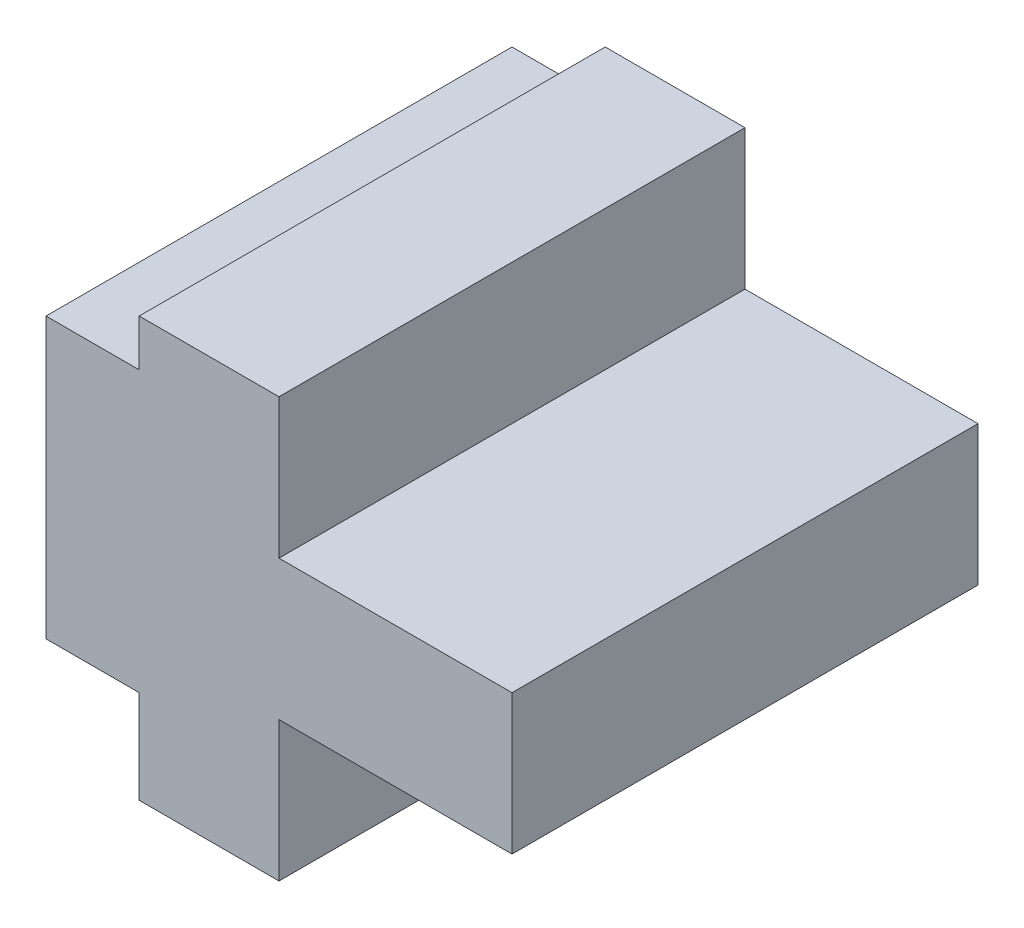
ISO-10303-21;
HEADER;
FILE_DESCRIPTION(('STEP AP214'),'2;1');
FILE_NAME('part.step','',(''),(''),'','','');
FILE_SCHEMA(('AUTOMOTIVE_DESIGN { 1 0 10303 214 1 1 1 1 }'));
ENDSEC;
DATA;
#1=APPLICATION_CONTEXT('core data for automotive mechanical design processes');
#2=APPLICATION_PROTOCOL_DEFINITION('international standard','automotive_design',2000,#1);
#3=PRODUCT_CONTEXT('',#1,'mechanical');
#4=PRODUCT('Part','Part','',(#3));
#5=PRODUCT_RELATED_PRODUCT_CATEGORY('part','',(#4));
#6=PRODUCT_DEFINITION_FORMATION('','',#4);
#7=PRODUCT_DEFINITION_CONTEXT('part definition',#1,'design');
#8=PRODUCT_DEFINITION('design','',#6,#7);
#9=PRODUCT_DEFINITION_SHAPE('','',#8);
#10=(LENGTH_UNIT() NAMED_UNIT(*) SI_UNIT(.MILLI.,.METRE.));
#11=(NAMED_UNIT(*) PLANE_ANGLE_UNIT() SI_UNIT($,.RADIAN.));
#12=(NAMED_UNIT(*) SI_UNIT($,.STERADIAN.) SOLID_ANGLE_UNIT());
#13=UNCERTAINTY_MEASURE_WITH_UNIT(LENGTH_MEASURE(1.E-05),#10,'distance_accuracy_value','');
#14=(GEOMETRIC_REPRESENTATION_CONTEXT(3) GLOBAL_UNCERTAINTY_ASSIGNED_CONTEXT((#13)) GLOBAL_UNIT_ASSIGNED_CONTEXT((#10,
#11,#12)) REPRESENTATION_CONTEXT('',''));
#15=CARTESIAN_POINT('',(0.,0.,0.));
#16=DIRECTION('',(0.,0.,1.));
#17=DIRECTION('',(1.,0.,0.));
#18=AXIS2_PLACEMENT_3D('',#15,#16,#17);
#19=CARTESIAN_POINT('',(-5.,2.,5.));
#20=DIRECTION('',(0.,1.,0.));
#21=DIRECTION('',(0.,0.,1.));
#22=AXIS2_PLACEMENT_3D('',#19,#20,#21);
#23=PLANE('',#22);
#24=DIRECTION('',(1.,0.,0.));
#25=VECTOR('',#24,1.);
#26=CARTESIAN_POINT('',(-5.,2.,-5.));
#27=LINE('',#26,#25);
#28=CARTESIAN_POINT('',(-5.,2.,-5.));
#29=VERTEX_POINT('',#28);
#30=CARTESIAN_POINT('',(-3.,2.,-5.));
#31=VERTEX_POINT('',#30);
#32=EDGE_CURVE('E168',#29,#31,#27,.T.);
#33=ORIENTED_EDGE('',*,*,#32,.T.);
#34=DIRECTION('',(0.,0.,-1.));
#35=VECTOR('',#34,1.);
#36=CARTESIAN_POINT('',(-3.,2.,5.));
#37=LINE('',#36,#35);
#38=CARTESIAN_POINT('',(-3.,2.,5.));
#39=VERTEX_POINT('',#38);
#40=EDGE_CURVE('E11',#39,#31,#37,.T.);
#41=ORIENTED_EDGE('',*,*,#40,.F.);
#42=DIRECTION('',(1.,0.,0.));
#43=VECTOR('',#42,1.);
#44=CARTESIAN_POINT('',(-5.,2.,5.));
#45=LINE('',#44,#43);
#46=CARTESIAN_POINT('',(-5.,2.,5.));
#47=VERTEX_POINT('',#46);
#48=EDGE_CURVE('E202',#47,#39,#45,.T.);
#49=ORIENTED_EDGE('',*,*,#48,.F.);
#50=DIRECTION('',(0.,0.,-1.));
#51=VECTOR('',#50,1.);
#52=CARTESIAN_POINT('',(-5.,2.,5.));
#53=LINE('',#52,#51);
#54=EDGE_CURVE('E164',#47,#29,#53,.T.);
#55=ORIENTED_EDGE('',*,*,#54,.T.);
#56=EDGE_LOOP('',(#33,#41,#49,#55));
#57=FACE_BOUND('',#56,.T.);
#58=ADVANCED_FACE('F43',(#57),#23,.F.);
#59=CARTESIAN_POINT('',(-3.,2.,5.));
#60=DIRECTION('',(1.,0.,0.));
#61=DIRECTION('',(0.,1.,0.));
#62=AXIS2_PLACEMENT_3D('',#59,#60,#61);
#63=PLANE('',#62);
#64=DIRECTION('',(0.,-1.,0.));
#65=VECTOR('',#64,1.);
#66=CARTESIAN_POINT('',(-3.,2.,-5.));
#67=LINE('',#66,#65);
#68=CARTESIAN_POINT('',(-3.,0.,-5.));
#69=VERTEX_POINT('',#68);
#70=EDGE_CURVE('E172',#31,#69,#67,.T.);
#71=ORIENTED_EDGE('',*,*,#70,.T.);
#72=DIRECTION('',(0.,0.,-1.));
#73=VECTOR('',#72,1.);
#74=CARTESIAN_POINT('',(-3.,0.,5.));
#75=LINE('',#74,#73);
#76=CARTESIAN_POINT('',(-3.,0.,5.));
#77=VERTEX_POINT('',#76);
#78=EDGE_CURVE('E52',#77,#69,#75,.T.);
#79=ORIENTED_EDGE('',*,*,#78,.F.);
#80=DIRECTION('',(0.,-1.,0.));
#81=VECTOR('',#80,1.);
#82=CARTESIAN_POINT('',(-3.,2.,5.));
#83=LINE('',#82,#81);
#84=EDGE_CURVE('E115',#39,#77,#83,.T.);
#85=ORIENTED_EDGE('',*,*,#84,.F.);
#86=ORIENTED_EDGE('',*,*,#40,.T.);
#87=EDGE_LOOP('',(#71,#79,#85,#86));
#88=FACE_BOUND('',#87,.T.);
#89=ADVANCED_FACE('F296',(#88),#63,.F.);
#90=CARTESIAN_POINT('',(-3.,0.,5.));
#91=DIRECTION('',(0.,1.,0.));
#92=DIRECTION('',(0.,0.,1.));
#93=AXIS2_PLACEMENT_3D('',#90,#91,#92);
#94=PLANE('',#93);
#95=DIRECTION('',(1.,0.,0.));
#96=VECTOR('',#95,1.);
#97=CARTESIAN_POINT('',(-3.,0.,-5.));
#98=LINE('',#97,#96);
#99=CARTESIAN_POINT('',(0.,0.,-5.));
#100=VERTEX_POINT('',#99);
#101=EDGE_CURVE('E175',#69,#100,#98,.T.);
#102=ORIENTED_EDGE('',*,*,#101,.T.);
#103=DIRECTION('',(0.,0.,-1.));
#104=VECTOR('',#103,1.);
#105=CARTESIAN_POINT('',(0.,0.,5.));
#106=LINE('',#105,#104);
#107=CARTESIAN_POINT('',(0.,0.,5.));
#108=VERTEX_POINT('',#107);
#109=EDGE_CURVE('E229',#108,#100,#106,.T.);
#110=ORIENTED_EDGE('',*,*,#109,.F.);
#111=DIRECTION('',(1.,0.,0.));
#112=VECTOR('',#111,1.);
#113=CARTESIAN_POINT('',(-3.,0.,5.));
#114=LINE('',#113,#112);
#115=EDGE_CURVE('E239',#77,#108,#114,.T.);
#116=ORIENTED_EDGE('',*,*,#115,.F.);
#117=ORIENTED_EDGE('',*,*,#78,.T.);
#118=EDGE_LOOP('',(#102,#110,#116,#117));
#119=FACE_BOUND('',#118,.T.);
#120=ADVANCED_FACE('F237',(#119),#94,.F.);
#121=CARTESIAN_POINT('',(0.,0.,5.));
#122=DIRECTION('',(-1.,0.,0.));
#123=DIRECTION('',(0.,-1.,0.));
#124=AXIS2_PLACEMENT_3D('',#121,#122,#123);
#125=PLANE('',#124);
#126=DIRECTION('',(0.,1.,0.));
#127=VECTOR('',#126,1.);
#128=CARTESIAN_POINT('',(0.,0.,-5.));
#129=LINE('',#128,#127);
#130=CARTESIAN_POINT('',(0.,3.,-5.));
#131=VERTEX_POINT('',#130);
#132=EDGE_CURVE('E178',#100,#131,#129,.T.);
#133=ORIENTED_EDGE('',*,*,#132,.T.);
#134=DIRECTION('',(0.,0.,-1.));
#135=VECTOR('',#134,1.);
#136=CARTESIAN_POINT('',(0.,3.,5.));
#137=LINE('',#136,#135);
#138=CARTESIAN_POINT('',(0.,3.,5.));
#139=VERTEX_POINT('',#138);
#140=EDGE_CURVE('E225',#139,#131,#137,.T.);
#141=ORIENTED_EDGE('',*,*,#140,.F.);
#142=DIRECTION('',(0.,1.,0.));
#143=VECTOR('',#142,1.);
#144=CARTESIAN_POINT('',(0.,0.,5.));
#145=LINE('',#144,#143);
#146=EDGE_CURVE('E258',#108,#139,#145,.T.);
#147=ORIENTED_EDGE('',*,*,#146,.F.);
#148=ORIENTED_EDGE('',*,*,#109,.T.);
#149=EDGE_LOOP('',(#133,#141,#147,#148));
#150=FACE_BOUND('',#149,.T.);
#151=ADVANCED_FACE('F248',(#150),#125,.F.);
#152=CARTESIAN_POINT('',(0.,3.,5.));
#153=DIRECTION('',(0.,1.,0.));
#154=DIRECTION('',(0.,0.,1.));
#155=AXIS2_PLACEMENT_3D('',#152,#153,#154);
#156=PLANE('',#155);
#157=DIRECTION('',(1.,0.,0.));
#158=VECTOR('',#157,1.);
#159=CARTESIAN_POINT('',(0.,3.,-5.));
#160=LINE('',#159,#158);
#161=CARTESIAN_POINT('',(5.,3.,-5.));
#162=VERTEX_POINT('',#161);
#163=EDGE_CURVE('E181',#131,#162,#160,.T.);
#164=ORIENTED_EDGE('',*,*,#163,.T.);
#165=DIRECTION('',(0.,0.,-1.));
#166=VECTOR('',#165,1.);
#167=CARTESIAN_POINT('',(5.,3.,5.));
#168=LINE('',#167,#166);
#169=CARTESIAN_POINT('',(5.,3.,5.));
#170=VERTEX_POINT('',#169);
#171=EDGE_CURVE('E221',#170,#162,#168,.T.);
#172=ORIENTED_EDGE('',*,*,#171,.F.);
#173=DIRECTION('',(1.,0.,0.));
#174=VECTOR('',#173,1.);
#175=CARTESIAN_POINT('',(0.,3.,5.));
#176=LINE('',#175,#174);
#177=EDGE_CURVE('E254',#139,#170,#176,.T.);
#178=ORIENTED_EDGE('',*,*,#177,.F.);
#179=ORIENTED_EDGE('',*,*,#140,.T.);
#180=EDGE_LOOP('',(#164,#172,#178,#179));
#181=FACE_BOUND('',#180,.T.);
#182=ADVANCED_FACE('F252',(#181),#156,.F.);
#183=CARTESIAN_POINT('',(5.,3.,5.));
#184=DIRECTION('',(-1.,0.,0.));
#185=DIRECTION('',(0.,-1.,0.));
#186=AXIS2_PLACEMENT_3D('',#183,#184,#185);
#187=PLANE('',#186);
#188=DIRECTION('',(0.,1.,0.));
#189=VECTOR('',#188,1.);
#190=CARTESIAN_POINT('',(5.,3.,-5.));
#191=LINE('',#190,#189);
#192=CARTESIAN_POINT('',(5.,6.,-5.));
#193=VERTEX_POINT('',#192);
#194=EDGE_CURVE('E184',#162,#193,#191,.T.);
#195=ORIENTED_EDGE('',*,*,#194,.T.);
#196=DIRECTION('',(0.,0.,-1.));
#197=VECTOR('',#196,1.);
#198=CARTESIAN_POINT('',(5.,6.,5.));
#199=LINE('',#198,#197);
#200=CARTESIAN_POINT('',(5.,6.,5.));
#201=VERTEX_POINT('',#200);
#202=EDGE_CURVE('E217',#201,#193,#199,.T.);
#203=ORIENTED_EDGE('',*,*,#202,.F.);
#204=DIRECTION('',(0.,1.,0.));
#205=VECTOR('',#204,1.);
#206=CARTESIAN_POINT('',(5.,3.,5.));
#207=LINE('',#206,#205);
#208=EDGE_CURVE('E257',#170,#201,#207,.T.);
#209=ORIENTED_EDGE('',*,*,#208,.F.);
#210=ORIENTED_EDGE('',*,*,#171,.T.);
#211=EDGE_LOOP('',(#195,#203,#209,#210));
#212=FACE_BOUND('',#211,.T.);
#213=ADVANCED_FACE('F309',(#212),#187,.F.);
#214=CARTESIAN_POINT('',(5.,6.,5.));
#215=DIRECTION('',(0.,-1.,0.));
#216=DIRECTION('',(1.,0.,0.));
#217=AXIS2_PLACEMENT_3D('',#214,#215,#216);
#218=PLANE('',#217);
#219=DIRECTION('',(-1.,0.,0.));
#220=VECTOR('',#219,1.);
#221=CARTESIAN_POINT('',(5.,6.,-5.));
#222=LINE('',#221,#220);
#223=CARTESIAN_POINT('',(0.,6.,-5.));
#224=VERTEX_POINT('',#223);
#225=EDGE_CURVE('E187',#193,#224,#222,.T.);
#226=ORIENTED_EDGE('',*,*,#225,.T.);
#227=DIRECTION('',(0.,0.,-1.));
#228=VECTOR('',#227,1.);
#229=CARTESIAN_POINT('',(0.,6.,5.));
#230=LINE('',#229,#228);
#231=CARTESIAN_POINT('',(0.,6.,5.));
#232=VERTEX_POINT('',#231);
#233=EDGE_CURVE('E213',#232,#224,#230,.T.);
#234=ORIENTED_EDGE('',*,*,#233,.F.);
#235=DIRECTION('',(-1.,0.,0.));
#236=VECTOR('',#235,1.);
#237=CARTESIAN_POINT('',(5.,6.,5.));
#238=LINE('',#237,#236);
#239=EDGE_CURVE('E262',#201,#232,#238,.T.);
#240=ORIENTED_EDGE('',*,*,#239,.F.);
#241=ORIENTED_EDGE('',*,*,#202,.T.);
#242=EDGE_LOOP('',(#226,#234,#240,#241));
#243=FACE_BOUND('',#242,.T.);
#244=ADVANCED_FACE('F312',(#243),#218,.F.);
#245=CARTESIAN_POINT('',(0.,6.,5.));
#246=DIRECTION('',(-1.,0.,0.));
#247=DIRECTION('',(0.,-1.,0.));
#248=AXIS2_PLACEMENT_3D('',#245,#246,#247);
#249=PLANE('',#248);
#250=DIRECTION('',(0.,1.,0.));
#251=VECTOR('',#250,1.);
#252=CARTESIAN_POINT('',(0.,6.,-5.));
#253=LINE('',#252,#251);
#254=CARTESIAN_POINT('',(0.,9.00000000000001,-5.));
#255=VERTEX_POINT('',#254);
#256=EDGE_CURVE('E190',#224,#255,#253,.T.);
#257=ORIENTED_EDGE('',*,*,#256,.T.);
#258=DIRECTION('',(0.,0.,-1.));
#259=VECTOR('',#258,1.);
#260=CARTESIAN_POINT('',(0.,9.00000000000001,5.));
#261=LINE('',#260,#259);
#262=CARTESIAN_POINT('',(0.,9.00000000000001,5.));
#263=VERTEX_POINT('',#262);
#264=EDGE_CURVE('E209',#263,#255,#261,.T.);
#265=ORIENTED_EDGE('',*,*,#264,.F.);
#266=DIRECTION('',(0.,1.,0.));
#267=VECTOR('',#266,1.);
#268=CARTESIAN_POINT('',(0.,6.,5.));
#269=LINE('',#268,#267);
#270=EDGE_CURVE('E269',#232,#263,#269,.T.);
#271=ORIENTED_EDGE('',*,*,#270,.F.);
#272=ORIENTED_EDGE('',*,*,#233,.T.);
#273=EDGE_LOOP('',(#257,#265,#271,#272));
#274=FACE_BOUND('',#273,.T.);
#275=ADVANCED_FACE('F277',(#274),#249,.F.);
#276=CARTESIAN_POINT('',(-3.,9.,5.));
#277=DIRECTION('',(0.,-1.,0.));
#278=DIRECTION('',(1.,0.,0.));
#279=AXIS2_PLACEMENT_3D('',#276,#277,#278);
#280=PLANE('',#279);
#281=DIRECTION('',(-1.,0.,0.));
#282=VECTOR('',#281,1.);
#283=CARTESIAN_POINT('',(-3.,9.,-5.));
#284=LINE('',#283,#282);
#285=CARTESIAN_POINT('',(-3.,9.,-5.));
#286=VERTEX_POINT('',#285);
#287=EDGE_CURVE('E193',#255,#286,#284,.T.);
#288=ORIENTED_EDGE('',*,*,#287,.T.);
#289=DIRECTION('',(0.,0.,-1.));
#290=VECTOR('',#289,1.);
#291=CARTESIAN_POINT('',(-3.,9.,5.));
#292=LINE('',#291,#290);
#293=CARTESIAN_POINT('',(-3.,9.,5.));
#294=VERTEX_POINT('',#293);
#295=EDGE_CURVE('E157',#294,#286,#292,.T.);
#296=ORIENTED_EDGE('',*,*,#295,.F.);
#297=DIRECTION('',(-1.,0.,0.));
#298=VECTOR('',#297,1.);
#299=CARTESIAN_POINT('',(-3.,9.,5.));
#300=LINE('',#299,#298);
#301=EDGE_CURVE('E146',#263,#294,#300,.T.);
#302=ORIENTED_EDGE('',*,*,#301,.F.);
#303=ORIENTED_EDGE('',*,*,#264,.T.);
#304=EDGE_LOOP('',(#288,#296,#302,#303));
#305=FACE_BOUND('',#304,.T.);
#306=ADVANCED_FACE('F281',(#305),#280,.F.);
#307=CARTESIAN_POINT('',(-3.,8.,5.));
#308=DIRECTION('',(1.,0.,0.));
#309=DIRECTION('',(0.,0.,-1.));
#310=AXIS2_PLACEMENT_3D('',#307,#308,#309);
#311=PLANE('',#310);
#312=DIRECTION('',(0.,-1.,0.));
#313=VECTOR('',#312,1.);
#314=CARTESIAN_POINT('',(-3.,8.,-5.));
#315=LINE('',#314,#313);
#316=CARTESIAN_POINT('',(-3.,8.,-5.));
#317=VERTEX_POINT('',#316);
#318=EDGE_CURVE('E155',#286,#317,#315,.T.);
#319=ORIENTED_EDGE('',*,*,#318,.T.);
#320=DIRECTION('',(0.,0.,-1.));
#321=VECTOR('',#320,1.);
#322=CARTESIAN_POINT('',(-3.,8.,5.));
#323=LINE('',#322,#321);
#324=CARTESIAN_POINT('',(-3.,8.,5.));
#325=VERTEX_POINT('',#324);
#326=EDGE_CURVE('E152',#325,#317,#323,.T.);
#327=ORIENTED_EDGE('',*,*,#326,.F.);
#328=DIRECTION('',(0.,-1.,0.));
#329=VECTOR('',#328,1.);
#330=CARTESIAN_POINT('',(-3.,8.,5.));
#331=LINE('',#330,#329);
#332=EDGE_CURVE('E140',#294,#325,#331,.T.);
#333=ORIENTED_EDGE('',*,*,#332,.F.);
#334=ORIENTED_EDGE('',*,*,#295,.T.);
#335=EDGE_LOOP('',(#319,#327,#333,#334));
#336=FACE_BOUND('',#335,.T.);
#337=ADVANCED_FACE('F153',(#336),#311,.F.);
#338=CARTESIAN_POINT('',(-5.,8.00000000000001,5.));
#339=DIRECTION('',(0.,-1.,0.));
#340=DIRECTION('',(1.,0.,0.));
#341=AXIS2_PLACEMENT_3D('',#338,#339,#340);
#342=PLANE('',#341);
#343=DIRECTION('',(-1.,0.,0.));
#344=VECTOR('',#343,1.);
#345=CARTESIAN_POINT('',(-5.,8.00000000000001,-5.));
#346=LINE('',#345,#344);
#347=CARTESIAN_POINT('',(-5.,8.00000000000001,-5.));
#348=VERTEX_POINT('',#347);
#349=EDGE_CURVE('E101',#317,#348,#346,.T.);
#350=ORIENTED_EDGE('',*,*,#349,.T.);
#351=DIRECTION('',(0.,0.,-1.));
#352=VECTOR('',#351,1.);
#353=CARTESIAN_POINT('',(-5.,8.00000000000001,5.));
#354=LINE('',#353,#352);
#355=CARTESIAN_POINT('',(-5.,8.00000000000001,5.));
#356=VERTEX_POINT('',#355);
#357=EDGE_CURVE('E158',#356,#348,#354,.T.);
#358=ORIENTED_EDGE('',*,*,#357,.F.);
#359=DIRECTION('',(-1.,0.,0.));
#360=VECTOR('',#359,1.);
#361=CARTESIAN_POINT('',(-5.,8.00000000000001,5.));
#362=LINE('',#361,#360);
#363=EDGE_CURVE('E144',#325,#356,#362,.T.);
#364=ORIENTED_EDGE('',*,*,#363,.F.);
#365=ORIENTED_EDGE('',*,*,#326,.T.);
#366=EDGE_LOOP('',(#350,#358,#364,#365));
#367=FACE_BOUND('',#366,.T.);
#368=ADVANCED_FACE('F160',(#367),#342,.F.);
#369=CARTESIAN_POINT('',(-5.,2.,5.));
#370=DIRECTION('',(1.,0.,0.));
#371=DIRECTION('',(0.,0.,-1.));
#372=AXIS2_PLACEMENT_3D('',#369,#370,#371);
#373=PLANE('',#372);
#374=DIRECTION('',(0.,-1.,0.));
#375=VECTOR('',#374,1.);
#376=CARTESIAN_POINT('',(-5.,2.,-5.));
#377=LINE('',#376,#375);
#378=EDGE_CURVE('E107',#348,#29,#377,.T.);
#379=ORIENTED_EDGE('',*,*,#378,.T.);
#380=ORIENTED_EDGE('',*,*,#54,.F.);
#381=DIRECTION('',(0.,-1.,0.));
#382=VECTOR('',#381,1.);
#383=CARTESIAN_POINT('',(-5.,2.,5.));
#384=LINE('',#383,#382);
#385=EDGE_CURVE('E60',#356,#47,#384,.T.);
#386=ORIENTED_EDGE('',*,*,#385,.F.);
#387=ORIENTED_EDGE('',*,*,#357,.T.);
#388=EDGE_LOOP('',(#379,#380,#386,#387));
#389=FACE_BOUND('',#388,.T.);
#390=ADVANCED_FACE('F285',(#389),#373,.F.);
#391=CARTESIAN_POINT('',(0.,0.,5.));
#392=DIRECTION('',(0.,0.,-1.));
#393=DIRECTION('',(-1.,0.,0.));
#394=AXIS2_PLACEMENT_3D('',#391,#392,#393);
#395=PLANE('',#394);
#396=ORIENTED_EDGE('',*,*,#48,.T.);
#397=ORIENTED_EDGE('',*,*,#84,.T.);
#398=ORIENTED_EDGE('',*,*,#115,.T.);
#399=ORIENTED_EDGE('',*,*,#146,.T.);
#400=ORIENTED_EDGE('',*,*,#177,.T.);
#401=ORIENTED_EDGE('',*,*,#208,.T.);
#402=ORIENTED_EDGE('',*,*,#239,.T.);
#403=ORIENTED_EDGE('',*,*,#270,.T.);
#404=ORIENTED_EDGE('',*,*,#301,.T.);
#405=ORIENTED_EDGE('',*,*,#332,.T.);
#406=ORIENTED_EDGE('',*,*,#363,.T.);
#407=ORIENTED_EDGE('',*,*,#385,.T.);
#408=EDGE_LOOP('',(#396,#397,#398,#399,#400,#401,#402,#403,#404,#405,#406,#407));
#409=FACE_BOUND('',#408,.T.);
#410=ADVANCED_FACE('F142',(#409),#395,.F.);
#411=CARTESIAN_POINT('',(0.,0.,-5.));
#412=DIRECTION('',(0.,0.,-1.));
#413=DIRECTION('',(-1.,0.,0.));
#414=AXIS2_PLACEMENT_3D('',#411,#412,#413);
#415=PLANE('',#414);
#416=ORIENTED_EDGE('',*,*,#32,.F.);
#417=ORIENTED_EDGE('',*,*,#378,.F.);
#418=ORIENTED_EDGE('',*,*,#349,.F.);
#419=ORIENTED_EDGE('',*,*,#318,.F.);
#420=ORIENTED_EDGE('',*,*,#287,.F.);
#421=ORIENTED_EDGE('',*,*,#256,.F.);
#422=ORIENTED_EDGE('',*,*,#225,.F.);
#423=ORIENTED_EDGE('',*,*,#194,.F.);
#424=ORIENTED_EDGE('',*,*,#163,.F.);
#425=ORIENTED_EDGE('',*,*,#132,.F.);
#426=ORIENTED_EDGE('',*,*,#101,.F.);
#427=ORIENTED_EDGE('',*,*,#70,.F.);
#428=EDGE_LOOP('',(#416,#417,#418,#419,#420,#421,#422,#423,#424,#425,#426,#427));
#429=FACE_BOUND('',#428,.T.);
#430=ADVANCED_FACE('F243',(#429),#415,.T.);
#431=CLOSED_SHELL('',(#58,#89,#120,#151,#182,#213,#244,#275,#306,#337,#368,#390,#410,#430));
#432=MANIFOLD_SOLID_BREP('B2',#431);
#433=ADVANCED_BREP_SHAPE_REPRESENTATION('',(#18,#432),#14);
#434=SHAPE_DEFINITION_REPRESENTATION(#9,#433);
ENDSEC;
END-ISO-10303-21;
